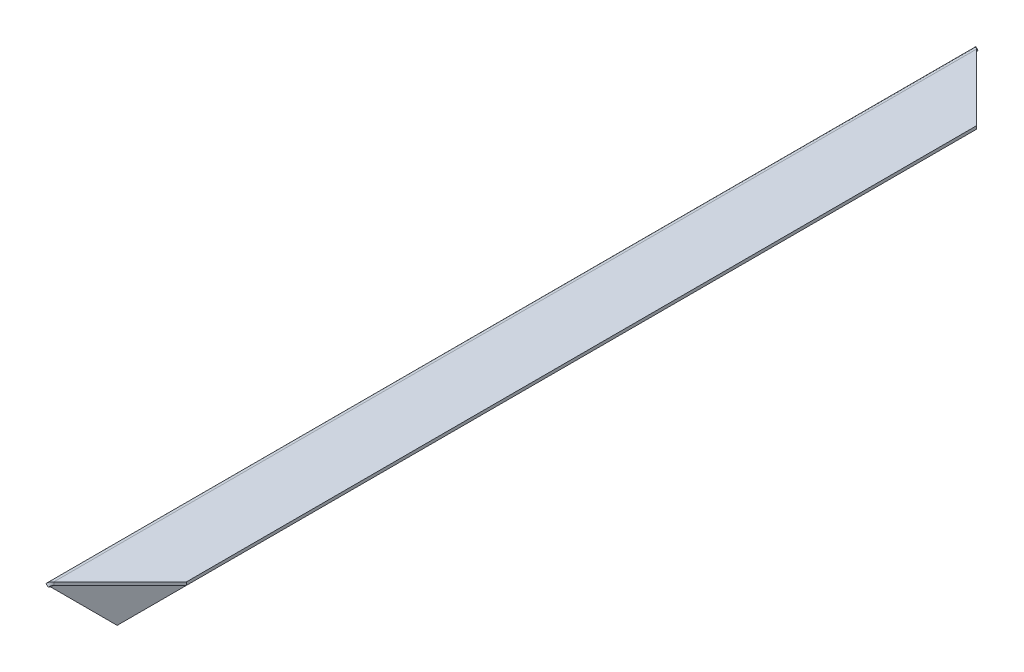
ISO-10303-21;
HEADER;
FILE_DESCRIPTION(('STEP AP214'),'2;1');
FILE_NAME('part.step','',(''),(''),'','','');
FILE_SCHEMA(('AUTOMOTIVE_DESIGN { 1 0 10303 214 1 1 1 1 }'));
ENDSEC;
DATA;
#1=APPLICATION_CONTEXT('core data for automotive mechanical design processes');
#2=APPLICATION_PROTOCOL_DEFINITION('international standard','automotive_design',2000,#1);
#3=PRODUCT_CONTEXT('',#1,'mechanical');
#4=PRODUCT('Part','Part','',(#3));
#5=PRODUCT_RELATED_PRODUCT_CATEGORY('part','',(#4));
#6=PRODUCT_DEFINITION_FORMATION('','',#4);
#7=PRODUCT_DEFINITION_CONTEXT('part definition',#1,'design');
#8=PRODUCT_DEFINITION('design','',#6,#7);
#9=PRODUCT_DEFINITION_SHAPE('','',#8);
#10=(LENGTH_UNIT() NAMED_UNIT(*) SI_UNIT(.MILLI.,.METRE.));
#11=(NAMED_UNIT(*) PLANE_ANGLE_UNIT() SI_UNIT($,.RADIAN.));
#12=(NAMED_UNIT(*) SI_UNIT($,.STERADIAN.) SOLID_ANGLE_UNIT());
#13=UNCERTAINTY_MEASURE_WITH_UNIT(LENGTH_MEASURE(1.E-05),#10,'distance_accuracy_value','');
#14=(GEOMETRIC_REPRESENTATION_CONTEXT(3) GLOBAL_UNCERTAINTY_ASSIGNED_CONTEXT((#13)) GLOBAL_UNIT_ASSIGNED_CONTEXT((#10,
#11,#12)) REPRESENTATION_CONTEXT('',''));
#15=CARTESIAN_POINT('',(0.,0.,0.));
#16=DIRECTION('',(0.,0.,1.));
#17=DIRECTION('',(1.,0.,0.));
#18=AXIS2_PLACEMENT_3D('',#15,#16,#17);
#19=CARTESIAN_POINT('',(-112.900713999999,0.188336430717542,0.));
#20=DIRECTION('',(-1.,0.,0.));
#21=DIRECTION('',(0.,0.,1.));
#22=AXIS2_PLACEMENT_3D('',#19,#20,#21);
#23=PLANE('',#22);
#24=DIRECTION('',(0.,-0.707106781186615,-0.70710678118648));
#25=VECTOR('',#24,1.);
#26=CARTESIAN_POINT('',(-112.900714,112.295300430737,112.106963999998));
#27=LINE('',#26,#25);
#28=CARTESIAN_POINT('',(-112.900714,111.427514,111.239177569261));
#29=VERTEX_POINT('',#28);
#30=CARTESIAN_POINT('',(-112.900714,95.4360504307374,95.2477140000016));
#31=VERTEX_POINT('',#30);
#32=EDGE_CURVE('E36',#29,#31,#27,.T.);
#33=ORIENTED_EDGE('',*,*,#32,.F.);
#34=DIRECTION('',(0.,0.,-1.));
#35=VECTOR('',#34,1.);
#36=CARTESIAN_POINT('',(-112.900714,111.427514,0.));
#37=LINE('',#36,#35);
#38=CARTESIAN_POINT('',(-112.900714,111.427514,-111.239177569261));
#39=VERTEX_POINT('',#38);
#40=EDGE_CURVE('E29',#29,#39,#37,.T.);
#41=ORIENTED_EDGE('',*,*,#40,.T.);
#42=DIRECTION('',(0.,0.707106781186616,-0.70710678118648));
#43=VECTOR('',#42,1.);
#44=CARTESIAN_POINT('',(-112.900714,112.295300430737,-112.106963999998));
#45=LINE('',#44,#43);
#46=CARTESIAN_POINT('',(-112.900714,95.4360504307374,-95.2477140000015));
#47=VERTEX_POINT('',#46);
#48=EDGE_CURVE('E44',#47,#39,#45,.T.);
#49=ORIENTED_EDGE('',*,*,#48,.F.);
#50=DIRECTION('',(0.,0.,-1.));
#51=VECTOR('',#50,1.);
#52=CARTESIAN_POINT('',(-112.900714,95.4360504307374,95.2477140000016));
#53=LINE('',#52,#51);
#54=EDGE_CURVE('E414',#31,#47,#53,.T.);
#55=ORIENTED_EDGE('',*,*,#54,.F.);
#56=EDGE_LOOP('',(#33,#41,#49,#55));
#57=FACE_BOUND('',#56,.T.);
#58=ADVANCED_FACE('F17',(#57),#23,.T.);
#59=CARTESIAN_POINT('',(-112.164114,112.295300430737,112.106963999998));
#60=DIRECTION('',(0.,0.70710678118648,-0.707106781186615));
#61=DIRECTION('',(0.,0.707106781186615,0.70710678118648));
#62=AXIS2_PLACEMENT_3D('',#59,#60,#61);
#63=PLANE('',#62);
#64=CARTESIAN_POINT('',(-112.900714,111.427514,111.239177569261));
#65=CARTESIAN_POINT('',(-112.164114,111.427514,111.239177569261));
#66=B_SPLINE_CURVE_WITH_KNOTS('',1,(#64,#65),.UNSPECIFIED.,.F.,.F.,(2,2),(0.,1.),.UNSPECIFIED.);
#67=CARTESIAN_POINT('',(-112.164114,111.427514,111.239177569261));
#68=VERTEX_POINT('',#67);
#69=EDGE_CURVE('E11',#29,#68,#66,.T.);
#70=ORIENTED_EDGE('',*,*,#69,.F.);
#71=ORIENTED_EDGE('',*,*,#32,.T.);
#72=DIRECTION('',(-1.,0.,0.));
#73=VECTOR('',#72,1.);
#74=CARTESIAN_POINT('',(-112.164114,95.4360504307374,95.2477140000016));
#75=LINE('',#74,#73);
#76=CARTESIAN_POINT('',(-112.164114,95.4360504307374,95.2477140000016));
#77=VERTEX_POINT('',#76);
#78=EDGE_CURVE('E457',#77,#31,#75,.T.);
#79=ORIENTED_EDGE('',*,*,#78,.F.);
#80=DIRECTION('',(0.,-0.707106781186615,-0.70710678118648));
#81=VECTOR('',#80,1.);
#82=CARTESIAN_POINT('',(-112.164114,112.295300430737,112.106963999998));
#83=LINE('',#82,#81);
#84=EDGE_CURVE('E260',#68,#77,#83,.T.);
#85=ORIENTED_EDGE('',*,*,#84,.F.);
#86=EDGE_LOOP('',(#70,#71,#79,#85));
#87=FACE_BOUND('',#86,.T.);
#88=ADVANCED_FACE('F19',(#87),#63,.F.);
#89=CARTESIAN_POINT('',(-112.164114,95.4360504307374,95.2477140000016));
#90=DIRECTION('',(0.,1.,0.));
#91=DIRECTION('',(0.,0.,1.));
#92=AXIS2_PLACEMENT_3D('',#89,#90,#91);
#93=PLANE('',#92);
#94=ORIENTED_EDGE('',*,*,#54,.T.);
#95=DIRECTION('',(-1.,0.,0.));
#96=VECTOR('',#95,1.);
#97=CARTESIAN_POINT('',(-112.164114,95.4360504307374,-95.2477140000015));
#98=LINE('',#97,#96);
#99=CARTESIAN_POINT('',(-112.164114,95.4360504307374,-95.2477140000015));
#100=VERTEX_POINT('',#99);
#101=EDGE_CURVE('E455',#100,#47,#98,.T.);
#102=ORIENTED_EDGE('',*,*,#101,.F.);
#103=DIRECTION('',(0.,0.,-1.));
#104=VECTOR('',#103,1.);
#105=CARTESIAN_POINT('',(-112.164114,95.4360504307374,95.2477140000016));
#106=LINE('',#105,#104);
#107=EDGE_CURVE('E453',#77,#100,#106,.T.);
#108=ORIENTED_EDGE('',*,*,#107,.F.);
#109=ORIENTED_EDGE('',*,*,#78,.T.);
#110=EDGE_LOOP('',(#94,#102,#108,#109));
#111=FACE_BOUND('',#110,.T.);
#112=ADVANCED_FACE('F235',(#111),#93,.F.);
#113=CARTESIAN_POINT('',(-112.164114,112.295300430737,-112.106963999998));
#114=DIRECTION('',(0.,0.70710678118648,0.707106781186616));
#115=DIRECTION('',(0.,-0.707106781186616,0.70710678118648));
#116=AXIS2_PLACEMENT_3D('',#113,#114,#115);
#117=PLANE('',#116);
#118=CARTESIAN_POINT('',(-112.164114,111.427514,-111.239177569261));
#119=CARTESIAN_POINT('',(-112.900714,111.427514,-111.239177569261));
#120=B_SPLINE_CURVE_WITH_KNOTS('',1,(#118,#119),.UNSPECIFIED.,.F.,.F.,(2,2),(0.,1.),.UNSPECIFIED.);
#121=CARTESIAN_POINT('',(-112.164114,111.427514,-111.239177569261));
#122=VERTEX_POINT('',#121);
#123=EDGE_CURVE('E272',#122,#39,#120,.T.);
#124=ORIENTED_EDGE('',*,*,#123,.F.);
#125=DIRECTION('',(0.,0.707106781186616,-0.70710678118648));
#126=VECTOR('',#125,1.);
#127=CARTESIAN_POINT('',(-112.164114,112.295300430737,-112.106963999998));
#128=LINE('',#127,#126);
#129=EDGE_CURVE('E450',#100,#122,#128,.T.);
#130=ORIENTED_EDGE('',*,*,#129,.F.);
#131=ORIENTED_EDGE('',*,*,#101,.T.);
#132=ORIENTED_EDGE('',*,*,#48,.T.);
#133=EDGE_LOOP('',(#124,#130,#131,#132));
#134=FACE_BOUND('',#133,.T.);
#135=ADVANCED_FACE('F238',(#134),#117,.F.);
#136=CARTESIAN_POINT('',(-112.164113999999,0.188336430717542,0.));
#137=DIRECTION('',(-1.,0.,0.));
#138=DIRECTION('',(0.,0.,1.));
#139=AXIS2_PLACEMENT_3D('',#136,#137,#138);
#140=PLANE('',#139);
#141=DIRECTION('',(0.,0.,-1.));
#142=VECTOR('',#141,1.);
#143=CARTESIAN_POINT('',(-112.164114,111.427514,0.));
#144=LINE('',#143,#142);
#145=EDGE_CURVE('E451',#68,#122,#144,.T.);
#146=ORIENTED_EDGE('',*,*,#145,.F.);
#147=ORIENTED_EDGE('',*,*,#84,.T.);
#148=ORIENTED_EDGE('',*,*,#107,.T.);
#149=ORIENTED_EDGE('',*,*,#129,.T.);
#150=EDGE_LOOP('',(#146,#147,#148,#149));
#151=FACE_BOUND('',#150,.T.);
#152=ADVANCED_FACE('F240',(#151),#140,.F.);
#153=CARTESIAN_POINT('',(-95.436050430738,112.164114,95.2477140000016));
#154=DIRECTION('',(-1.,0.,0.));
#155=DIRECTION('',(0.,0.,-1.));
#156=AXIS2_PLACEMENT_3D('',#153,#154,#155);
#157=PLANE('',#156);
#158=DIRECTION('',(0.,0.,1.));
#159=VECTOR('',#158,1.);
#160=CARTESIAN_POINT('',(-95.436050430738,112.900714,95.2477140000016));
#161=LINE('',#160,#159);
#162=CARTESIAN_POINT('',(-95.436050430738,112.900714,-95.2477140000015));
#163=VERTEX_POINT('',#162);
#164=CARTESIAN_POINT('',(-95.436050430738,112.900714,95.2477140000016));
#165=VERTEX_POINT('',#164);
#166=EDGE_CURVE('E383',#163,#165,#161,.T.);
#167=ORIENTED_EDGE('',*,*,#166,.T.);
#168=DIRECTION('',(0.,1.,0.));
#169=VECTOR('',#168,1.);
#170=CARTESIAN_POINT('',(-95.436050430738,112.164114,95.2477140000016));
#171=LINE('',#170,#169);
#172=CARTESIAN_POINT('',(-95.436050430738,112.164114,95.2477140000016));
#173=VERTEX_POINT('',#172);
#174=EDGE_CURVE('E411',#173,#165,#171,.T.);
#175=ORIENTED_EDGE('',*,*,#174,.F.);
#176=DIRECTION('',(0.,0.,1.));
#177=VECTOR('',#176,1.);
#178=CARTESIAN_POINT('',(-95.436050430738,112.164114,95.2477140000016));
#179=LINE('',#178,#177);
#180=CARTESIAN_POINT('',(-95.436050430738,112.164114,-95.2477140000015));
#181=VERTEX_POINT('',#180);
#182=EDGE_CURVE('E202',#181,#173,#179,.T.);
#183=ORIENTED_EDGE('',*,*,#182,.F.);
#184=DIRECTION('',(0.,1.,0.));
#185=VECTOR('',#184,1.);
#186=CARTESIAN_POINT('',(-95.436050430738,112.164114,-95.2477140000015));
#187=LINE('',#186,#185);
#188=EDGE_CURVE('E200',#181,#163,#187,.T.);
#189=ORIENTED_EDGE('',*,*,#188,.T.);
#190=EDGE_LOOP('',(#167,#175,#183,#189));
#191=FACE_BOUND('',#190,.T.);
#192=ADVANCED_FACE('F242',(#191),#157,.F.);
#193=CARTESIAN_POINT('',(-224.402264430758,112.164113999999,0.));
#194=DIRECTION('',(0.,1.,0.));
#195=DIRECTION('',(0.,0.,1.));
#196=AXIS2_PLACEMENT_3D('',#193,#194,#195);
#197=PLANE('',#196);
#198=DIRECTION('',(-0.707106781186614,0.,0.707106781186481));
#199=VECTOR('',#198,1.);
#200=CARTESIAN_POINT('',(-112.295300430738,112.164114,112.106963999998));
#201=LINE('',#200,#199);
#202=CARTESIAN_POINT('',(-111.427514,112.164114,111.239177569261));
#203=VERTEX_POINT('',#202);
#204=EDGE_CURVE('E191',#173,#203,#201,.T.);
#205=ORIENTED_EDGE('',*,*,#204,.T.);
#206=DIRECTION('',(0.,0.,-1.));
#207=VECTOR('',#206,1.);
#208=CARTESIAN_POINT('',(-111.427514,112.164114,0.));
#209=LINE('',#208,#207);
#210=CARTESIAN_POINT('',(-111.427514,112.164114,-111.239177569261));
#211=VERTEX_POINT('',#210);
#212=EDGE_CURVE('E133',#203,#211,#209,.T.);
#213=ORIENTED_EDGE('',*,*,#212,.T.);
#214=DIRECTION('',(0.707106781186614,0.,0.707106781186481));
#215=VECTOR('',#214,1.);
#216=CARTESIAN_POINT('',(-112.295300430738,112.164114,-112.106963999998));
#217=LINE('',#216,#215);
#218=EDGE_CURVE('E188',#211,#181,#217,.T.);
#219=ORIENTED_EDGE('',*,*,#218,.T.);
#220=ORIENTED_EDGE('',*,*,#182,.T.);
#221=EDGE_LOOP('',(#205,#213,#219,#220));
#222=FACE_BOUND('',#221,.T.);
#223=ADVANCED_FACE('F187',(#222),#197,.F.);
#224=CARTESIAN_POINT('',(-112.295300430738,112.164114,-112.106963999998));
#225=DIRECTION('',(-0.707106781186481,0.,0.707106781186614));
#226=DIRECTION('',(-0.707106781186614,0.,-0.707106781186481));
#227=AXIS2_PLACEMENT_3D('',#224,#225,#226);
#228=PLANE('',#227);
#229=ORIENTED_EDGE('',*,*,#218,.F.);
#230=CARTESIAN_POINT('',(-111.427514,112.900714,-111.239177569261));
#231=CARTESIAN_POINT('',(-111.427514,112.164114,-111.239177569261));
#232=B_SPLINE_CURVE_WITH_KNOTS('',1,(#230,#231),.UNSPECIFIED.,.F.,.F.,(2,2),(0.,1.),.UNSPECIFIED.);
#233=CARTESIAN_POINT('',(-111.427514,112.900714,-111.239177569261));
#234=VERTEX_POINT('',#233);
#235=EDGE_CURVE('E197',#211,#234,#232,.F.);
#236=ORIENTED_EDGE('',*,*,#235,.T.);
#237=DIRECTION('',(0.707106781186614,0.,0.707106781186481));
#238=VECTOR('',#237,1.);
#239=CARTESIAN_POINT('',(-112.295300430738,112.900714,-112.106963999998));
#240=LINE('',#239,#238);
#241=EDGE_CURVE('E386',#234,#163,#240,.T.);
#242=ORIENTED_EDGE('',*,*,#241,.T.);
#243=ORIENTED_EDGE('',*,*,#188,.F.);
#244=EDGE_LOOP('',(#229,#236,#242,#243));
#245=FACE_BOUND('',#244,.T.);
#246=ADVANCED_FACE('F196',(#245),#228,.F.);
#247=CARTESIAN_POINT('',(-224.402264430758,112.900713999999,0.));
#248=DIRECTION('',(0.,1.,0.));
#249=DIRECTION('',(0.,0.,1.));
#250=AXIS2_PLACEMENT_3D('',#247,#248,#249);
#251=PLANE('',#250);
#252=DIRECTION('',(0.,0.,-1.));
#253=VECTOR('',#252,1.);
#254=CARTESIAN_POINT('',(-111.427514,112.900714,0.));
#255=LINE('',#254,#253);
#256=CARTESIAN_POINT('',(-111.427514,112.900714,111.239177569261));
#257=VERTEX_POINT('',#256);
#258=EDGE_CURVE('E114',#257,#234,#255,.T.);
#259=ORIENTED_EDGE('',*,*,#258,.F.);
#260=DIRECTION('',(-0.707106781186614,0.,0.707106781186481));
#261=VECTOR('',#260,1.);
#262=CARTESIAN_POINT('',(-112.295300430738,112.900714,112.106963999998));
#263=LINE('',#262,#261);
#264=EDGE_CURVE('E221',#165,#257,#263,.T.);
#265=ORIENTED_EDGE('',*,*,#264,.F.);
#266=ORIENTED_EDGE('',*,*,#166,.F.);
#267=ORIENTED_EDGE('',*,*,#241,.F.);
#268=EDGE_LOOP('',(#259,#265,#266,#267));
#269=FACE_BOUND('',#268,.T.);
#270=ADVANCED_FACE('F233',(#269),#251,.T.);
#271=CARTESIAN_POINT('',(-112.295300430738,112.164114,112.106963999998));
#272=DIRECTION('',(-0.707106781186481,0.,-0.707106781186614));
#273=DIRECTION('',(0.707106781186614,0.,-0.707106781186481));
#274=AXIS2_PLACEMENT_3D('',#271,#272,#273);
#275=PLANE('',#274);
#276=ORIENTED_EDGE('',*,*,#264,.T.);
#277=CARTESIAN_POINT('',(-111.427514,112.164114,111.239177569261));
#278=CARTESIAN_POINT('',(-111.427514,112.900714,111.239177569261));
#279=B_SPLINE_CURVE_WITH_KNOTS('',1,(#277,#278),.UNSPECIFIED.,.F.,.F.,(2,2),(0.,1.),.UNSPECIFIED.);
#280=EDGE_CURVE('E216',#257,#203,#279,.F.);
#281=ORIENTED_EDGE('',*,*,#280,.T.);
#282=ORIENTED_EDGE('',*,*,#204,.F.);
#283=ORIENTED_EDGE('',*,*,#174,.T.);
#284=EDGE_LOOP('',(#276,#281,#282,#283));
#285=FACE_BOUND('',#284,.T.);
#286=ADVANCED_FACE('F223',(#285),#275,.F.);
#287=CARTESIAN_POINT('',(-112.469223710044,112.469223710044,112.106963999998));
#288=CARTESIAN_POINT('',(-112.605598926777,112.332848493311,111.962316239192));
#289=CARTESIAN_POINT('',(-112.714776107324,112.169445481882,111.817701856419));
#290=CARTESIAN_POINT('',(-112.862370547268,111.813120983238,111.52843971284));
#291=CARTESIAN_POINT('',(-112.900714,111.620377681075,111.383825330067));
#292=CARTESIAN_POINT('',(-112.900714,111.427514,111.239177569261));
#293=CARTESIAN_POINT('',(-111.948368855022,111.948368855022,112.106963999998));
#294=CARTESIAN_POINT('',(-112.016552378456,111.880185331588,111.962324904643));
#295=CARTESIAN_POINT('',(-112.071145053662,111.798479740941,111.817701856419));
#296=CARTESIAN_POINT('',(-112.144942273634,111.620317491619,111.52843971284));
#297=CARTESIAN_POINT('',(-112.164114,111.52394006357,111.383816664616));
#298=CARTESIAN_POINT('',(-112.164114,111.427514,111.239177569261));
#299=B_SPLINE_SURFACE_WITH_KNOTS('',1,3,((#287,#288,#289,#290,#291,#292),(#293,#294,#295,#296,
#297,#298)),.UNSPECIFIED.,.F.,.F.,.F.,(2,2),(4,2,4),(0.,1.),(0.,0.5,1.),.UNSPECIFIED.);
#300=CARTESIAN_POINT('',(-112.469223710044,112.469223710044,112.106963999998));
#301=CARTESIAN_POINT('',(-111.948368855022,111.948368855022,112.106963999998));
#302=B_SPLINE_CURVE_WITH_KNOTS('',1,(#300,#301),.UNSPECIFIED.,.F.,.F.,(2,2),(0.,1.),.UNSPECIFIED.);
#303=CARTESIAN_POINT('',(-112.469223945747,112.469223474341,112.106963749998));
#304=VERTEX_POINT('',#303);
#305=CARTESIAN_POINT('',(-111.948368855022,111.948368855022,112.106963999998));
#306=VERTEX_POINT('',#305);
#307=EDGE_CURVE('E99',#304,#306,#302,.T.);
#308=CARTESIAN_POINT('',(-112.469223710044,112.469223710044,112.106963999998));
#309=CARTESIAN_POINT('',(-112.605598926777,112.332848493311,111.962316239192));
#310=CARTESIAN_POINT('',(-112.714776107324,112.169445481882,111.817701856419));
#311=CARTESIAN_POINT('',(-112.862370547268,111.813120983238,111.52843971284));
#312=CARTESIAN_POINT('',(-112.900714,111.620377681075,111.383825330067));
#313=CARTESIAN_POINT('',(-112.900714,111.427514,111.239177569261));
#314=B_SPLINE_CURVE_WITH_KNOTS('',3,(#308,#309,#310,#311,#312,#313),.UNSPECIFIED.,.F.,.F.,(4,2,
4),(0.,0.5,1.),.UNSPECIFIED.);
#315=EDGE_CURVE('E266',#304,#29,#314,.T.);
#316=CARTESIAN_POINT('',(-112.164114,111.427514,111.239177569261));
#317=CARTESIAN_POINT('',(-112.164114,111.52394006357,111.383816664616));
#318=CARTESIAN_POINT('',(-112.144942273634,111.620317491619,111.52843971284));
#319=CARTESIAN_POINT('',(-112.071145053662,111.798479740941,111.817701856419));
#320=CARTESIAN_POINT('',(-112.016552378456,111.880185331588,111.962324904643));
#321=CARTESIAN_POINT('',(-111.948368855022,111.948368855022,112.106963999998));
#322=B_SPLINE_CURVE_WITH_KNOTS('',3,(#316,#317,#318,#319,#320,#321),.UNSPECIFIED.,.F.,.F.,(4,2,
4),(0.,0.5,1.),.UNSPECIFIED.);
#323=EDGE_CURVE('E119',#306,#68,#322,.F.);
#324=ORIENTED_EDGE('',*,*,#307,.F.);
#325=ORIENTED_EDGE('',*,*,#315,.T.);
#326=ORIENTED_EDGE('',*,*,#69,.T.);
#327=ORIENTED_EDGE('',*,*,#323,.F.);
#328=EDGE_LOOP('',(#324,#325,#326,#327));
#329=FACE_BOUND('',#328,.T.);
#330=ADVANCED_FACE('F121',(#329),#299,.F.);
#331=CARTESIAN_POINT('',(-112.900714,111.427514,-111.239177569261));
#332=CARTESIAN_POINT('',(-112.900714,111.620377681075,-111.383825330067));
#333=CARTESIAN_POINT('',(-112.862370547268,111.813120983238,-111.52843971284));
#334=CARTESIAN_POINT('',(-112.714776107324,112.169445481882,-111.817701856419));
#335=CARTESIAN_POINT('',(-112.605598926777,112.332848493311,-111.962316239192));
#336=CARTESIAN_POINT('',(-112.469223710044,112.469223710044,-112.106963999998));
#337=CARTESIAN_POINT('',(-112.164114,111.427514,-111.239177569261));
#338=CARTESIAN_POINT('',(-112.164114,111.52394006357,-111.383816664616));
#339=CARTESIAN_POINT('',(-112.144942273634,111.620317491619,-111.52843971284));
#340=CARTESIAN_POINT('',(-112.071145053662,111.798479740941,-111.817701856419));
#341=CARTESIAN_POINT('',(-112.016552378456,111.880185331588,-111.962324904643));
#342=CARTESIAN_POINT('',(-111.948368855022,111.948368855022,-112.106963999998));
#343=B_SPLINE_SURFACE_WITH_KNOTS('',1,3,((#331,#332,#333,#334,#335,#336),(#337,#338,#339,#340,
#341,#342)),.UNSPECIFIED.,.F.,.F.,.F.,(2,2),(4,2,4),(0.,1.),(0.,0.5,1.),.UNSPECIFIED.);
#344=CARTESIAN_POINT('',(-112.900714,111.427514,-111.239177569261));
#345=CARTESIAN_POINT('',(-112.900714,111.620377681075,-111.383825330067));
#346=CARTESIAN_POINT('',(-112.862370547268,111.813120983238,-111.52843971284));
#347=CARTESIAN_POINT('',(-112.714776107324,112.169445481882,-111.817701856419));
#348=CARTESIAN_POINT('',(-112.605598926777,112.332848493311,-111.962316239192));
#349=CARTESIAN_POINT('',(-112.469223710044,112.469223710044,-112.106963999998));
#350=B_SPLINE_CURVE_WITH_KNOTS('',3,(#344,#345,#346,#347,#348,#349),.UNSPECIFIED.,.F.,.F.,(4,2,
4),(0.,0.5,1.),.UNSPECIFIED.);
#351=CARTESIAN_POINT('',(-112.469223945747,112.469223474341,-112.106963749998));
#352=VERTEX_POINT('',#351);
#353=EDGE_CURVE('E269',#39,#352,#350,.T.);
#354=CARTESIAN_POINT('',(-112.469223710044,112.469223710044,-112.106963999998));
#355=CARTESIAN_POINT('',(-111.948368855022,111.948368855022,-112.106963999998));
#356=B_SPLINE_CURVE_WITH_KNOTS('',1,(#354,#355),.UNSPECIFIED.,.F.,.F.,(2,2),(0.,1.),.UNSPECIFIED.);
#357=CARTESIAN_POINT('',(-111.948368855022,111.948368855022,-112.106963999998));
#358=VERTEX_POINT('',#357);
#359=EDGE_CURVE('E115',#352,#358,#356,.T.);
#360=CARTESIAN_POINT('',(-111.948368855022,111.948368855022,-112.106963999998));
#361=CARTESIAN_POINT('',(-112.016552378456,111.880185331588,-111.962324904643));
#362=CARTESIAN_POINT('',(-112.071145053662,111.798479740941,-111.817701856419));
#363=CARTESIAN_POINT('',(-112.144942273634,111.620317491619,-111.52843971284));
#364=CARTESIAN_POINT('',(-112.164114,111.52394006357,-111.383816664616));
#365=CARTESIAN_POINT('',(-112.164114,111.427514,-111.239177569261));
#366=B_SPLINE_CURVE_WITH_KNOTS('',3,(#360,#361,#362,#363,#364,#365),.UNSPECIFIED.,.F.,.F.,(4,2,
4),(0.,0.5,1.),.UNSPECIFIED.);
#367=EDGE_CURVE('E126',#122,#358,#366,.F.);
#368=ORIENTED_EDGE('',*,*,#123,.T.);
#369=ORIENTED_EDGE('',*,*,#353,.T.);
#370=ORIENTED_EDGE('',*,*,#359,.T.);
#371=ORIENTED_EDGE('',*,*,#367,.F.);
#372=EDGE_LOOP('',(#368,#369,#370,#371));
#373=FACE_BOUND('',#372,.T.);
#374=ADVANCED_FACE('F287',(#373),#343,.F.);
#375=CARTESIAN_POINT('',(-112.469223710044,112.469223710044,-112.106963999998));
#376=CARTESIAN_POINT('',(-112.332848493311,112.605598926776,-111.962316239192));
#377=CARTESIAN_POINT('',(-112.169445481883,112.714776107323,-111.817701856419));
#378=CARTESIAN_POINT('',(-111.813120983238,112.862370547267,-111.52843971284));
#379=CARTESIAN_POINT('',(-111.620377681075,112.900714,-111.383825330067));
#380=CARTESIAN_POINT('',(-111.427514,112.900714,-111.239177569261));
#381=CARTESIAN_POINT('',(-111.948368855022,111.948368855022,-112.106963999998));
#382=CARTESIAN_POINT('',(-111.880185331589,112.016552378455,-111.962324904643));
#383=CARTESIAN_POINT('',(-111.798479740941,112.071145053661,-111.817701856419));
#384=CARTESIAN_POINT('',(-111.620317491619,112.144942273634,-111.52843971284));
#385=CARTESIAN_POINT('',(-111.52394006357,112.164114,-111.383816664616));
#386=CARTESIAN_POINT('',(-111.427514,112.164114,-111.239177569261));
#387=B_SPLINE_SURFACE_WITH_KNOTS('',1,3,((#375,#376,#377,#378,#379,#380),(#381,#382,#383,#384,
#385,#386)),.UNSPECIFIED.,.F.,.F.,.F.,(2,2),(4,2,4),(0.,1.),(0.,0.5,1.),.UNSPECIFIED.);
#388=CARTESIAN_POINT('',(-112.469223710044,112.469223710044,-112.106963999998));
#389=CARTESIAN_POINT('',(-112.332848493311,112.605598926776,-111.962316239192));
#390=CARTESIAN_POINT('',(-112.169445481883,112.714776107323,-111.817701856419));
#391=CARTESIAN_POINT('',(-111.813120983238,112.862370547267,-111.52843971284));
#392=CARTESIAN_POINT('',(-111.620377681075,112.900714,-111.383825330067));
#393=CARTESIAN_POINT('',(-111.427514,112.900714,-111.239177569261));
#394=B_SPLINE_CURVE_WITH_KNOTS('',3,(#388,#389,#390,#391,#392,#393),.UNSPECIFIED.,.F.,.F.,(4,2,
4),(0.,0.5,1.),.UNSPECIFIED.);
#395=EDGE_CURVE('E370',#352,#234,#394,.T.);
#396=CARTESIAN_POINT('',(-111.427514,112.164114,-111.239177569261));
#397=CARTESIAN_POINT('',(-111.52394006357,112.164114,-111.383816664616));
#398=CARTESIAN_POINT('',(-111.620317491619,112.144942273634,-111.52843971284));
#399=CARTESIAN_POINT('',(-111.798479740941,112.071145053661,-111.817701856419));
#400=CARTESIAN_POINT('',(-111.880185331589,112.016552378455,-111.962324904643));
#401=CARTESIAN_POINT('',(-111.948368855022,111.948368855022,-112.106963999998));
#402=B_SPLINE_CURVE_WITH_KNOTS('',3,(#396,#397,#398,#399,#400,#401),.UNSPECIFIED.,.F.,.F.,(4,2,
4),(0.,0.5,1.),.UNSPECIFIED.);
#403=EDGE_CURVE('E134',#358,#211,#402,.F.);
#404=ORIENTED_EDGE('',*,*,#359,.F.);
#405=ORIENTED_EDGE('',*,*,#395,.T.);
#406=ORIENTED_EDGE('',*,*,#235,.F.);
#407=ORIENTED_EDGE('',*,*,#403,.F.);
#408=EDGE_LOOP('',(#404,#405,#406,#407));
#409=FACE_BOUND('',#408,.T.);
#410=ADVANCED_FACE('F157',(#409),#387,.F.);
#411=CARTESIAN_POINT('',(-111.427514,112.900714,111.239177569261));
#412=CARTESIAN_POINT('',(-111.620377681075,112.900714,111.383825330067));
#413=CARTESIAN_POINT('',(-111.813120983238,112.862370547267,111.52843971284));
#414=CARTESIAN_POINT('',(-112.169445481883,112.714776107323,111.817701856419));
#415=CARTESIAN_POINT('',(-112.332848493311,112.605598926776,111.962316239192));
#416=CARTESIAN_POINT('',(-112.469223710044,112.469223710044,112.106963999998));
#417=CARTESIAN_POINT('',(-111.427514,112.164114,111.239177569261));
#418=CARTESIAN_POINT('',(-111.52394006357,112.164114,111.383816664616));
#419=CARTESIAN_POINT('',(-111.620317491619,112.144942273633,111.52843971284));
#420=CARTESIAN_POINT('',(-111.798479740941,112.071145053661,111.817701856419));
#421=CARTESIAN_POINT('',(-111.880185331589,112.016552378455,111.962324904643));
#422=CARTESIAN_POINT('',(-111.948368855022,111.948368855022,112.106963999998));
#423=B_SPLINE_SURFACE_WITH_KNOTS('',1,3,((#411,#412,#413,#414,#415,#416),(#417,#418,#419,#420,
#421,#422)),.UNSPECIFIED.,.F.,.F.,.F.,(2,2),(4,2,4),(0.,1.),(0.,0.5,1.),.UNSPECIFIED.);
#424=CARTESIAN_POINT('',(-111.427514,112.900714,111.239177569261));
#425=CARTESIAN_POINT('',(-111.620377681075,112.900714,111.383825330067));
#426=CARTESIAN_POINT('',(-111.813120983238,112.862370547267,111.52843971284));
#427=CARTESIAN_POINT('',(-112.169445481883,112.714776107323,111.817701856419));
#428=CARTESIAN_POINT('',(-112.332848493311,112.605598926776,111.962316239192));
#429=CARTESIAN_POINT('',(-112.469223710044,112.469223710044,112.106963999998));
#430=B_SPLINE_CURVE_WITH_KNOTS('',3,(#424,#425,#426,#427,#428,#429),.UNSPECIFIED.,.F.,.F.,(4,2,
4),(0.,0.5,1.),.UNSPECIFIED.);
#431=EDGE_CURVE('E108',#257,#304,#430,.T.);
#432=CARTESIAN_POINT('',(-111.948368855022,111.948368855022,112.106963999998));
#433=CARTESIAN_POINT('',(-111.880185331589,112.016552378455,111.962324904643));
#434=CARTESIAN_POINT('',(-111.798479740941,112.071145053661,111.817701856419));
#435=CARTESIAN_POINT('',(-111.620317491619,112.144942273633,111.52843971284));
#436=CARTESIAN_POINT('',(-111.52394006357,112.164114,111.383816664616));
#437=CARTESIAN_POINT('',(-111.427514,112.164114,111.239177569261));
#438=B_SPLINE_CURVE_WITH_KNOTS('',3,(#432,#433,#434,#435,#436,#437),.UNSPECIFIED.,.F.,.F.,(4,2,
4),(0.,0.5,1.),.UNSPECIFIED.);
#439=EDGE_CURVE('E104',#203,#306,#438,.F.);
#440=ORIENTED_EDGE('',*,*,#431,.T.);
#441=ORIENTED_EDGE('',*,*,#307,.T.);
#442=ORIENTED_EDGE('',*,*,#439,.F.);
#443=ORIENTED_EDGE('',*,*,#280,.F.);
#444=EDGE_LOOP('',(#440,#441,#442,#443));
#445=FACE_BOUND('',#444,.T.);
#446=ADVANCED_FACE('F102',(#445),#423,.F.);
#447=CARTESIAN_POINT('',(-111.427514,111.427514,224.221855094246));
#448=DIRECTION('',(0.,0.,-1.));
#449=DIRECTION('',(1.,0.,0.));
#450=AXIS2_PLACEMENT_3D('',#447,#448,#449);
#451=CYLINDRICAL_SURFACE('',#450,0.7366);
#452=ORIENTED_EDGE('',*,*,#212,.F.);
#453=ORIENTED_EDGE('',*,*,#439,.T.);
#454=ORIENTED_EDGE('',*,*,#323,.T.);
#455=ORIENTED_EDGE('',*,*,#145,.T.);
#456=ORIENTED_EDGE('',*,*,#367,.T.);
#457=ORIENTED_EDGE('',*,*,#403,.T.);
#458=EDGE_LOOP('',(#452,#453,#454,#455,#456,#457));
#459=FACE_BOUND('',#458,.T.);
#460=ADVANCED_FACE('F130',(#459),#451,.F.);
#461=CARTESIAN_POINT('',(-111.427514,111.427514,224.221855094246));
#462=DIRECTION('',(0.,0.,-1.));
#463=DIRECTION('',(1.,0.,0.));
#464=AXIS2_PLACEMENT_3D('',#461,#462,#463);
#465=CYLINDRICAL_SURFACE('',#464,1.4732);
#466=ORIENTED_EDGE('',*,*,#258,.T.);
#467=ORIENTED_EDGE('',*,*,#395,.F.);
#468=ORIENTED_EDGE('',*,*,#353,.F.);
#469=ORIENTED_EDGE('',*,*,#40,.F.);
#470=ORIENTED_EDGE('',*,*,#315,.F.);
#471=ORIENTED_EDGE('',*,*,#431,.F.);
#472=EDGE_LOOP('',(#466,#467,#468,#469,#470,#471));
#473=FACE_BOUND('',#472,.T.);
#474=ADVANCED_FACE('F156',(#473),#465,.T.);
#475=CLOSED_SHELL('',(#58,#88,#112,#135,#152,#192,#223,#246,#270,#286,#330,#374,#410,#446,#460,#474));
#476=MANIFOLD_SOLID_BREP('B1',#475);
#477=ADVANCED_BREP_SHAPE_REPRESENTATION('',(#18,#476),#14);
#478=SHAPE_DEFINITION_REPRESENTATION(#9,#477);
ENDSEC;
END-ISO-10303-21;
